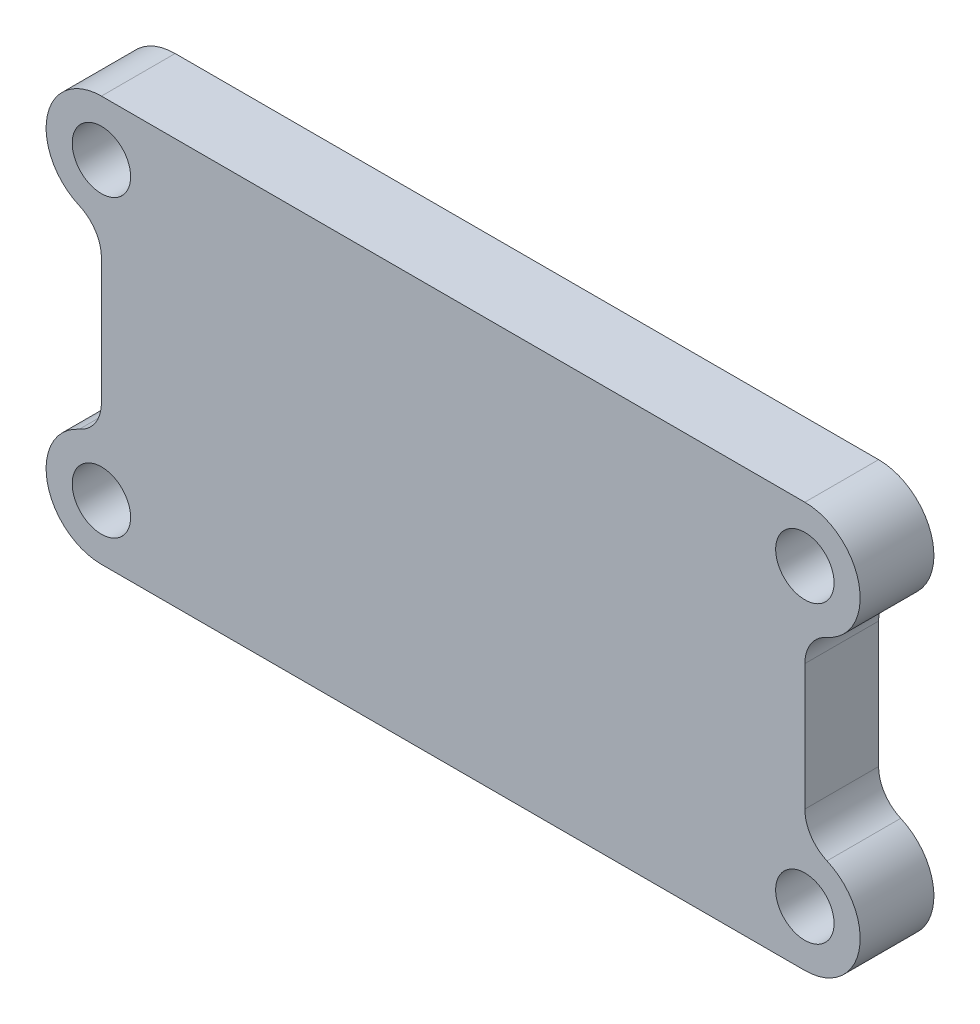
ISO-10303-21;
HEADER;
FILE_DESCRIPTION(('STEP AP214'),'2;1');
FILE_NAME('part.step','',(''),(''),'','','');
FILE_SCHEMA(('AUTOMOTIVE_DESIGN { 1 0 10303 214 1 1 1 1 }'));
ENDSEC;
DATA;
#1=APPLICATION_CONTEXT('core data for automotive mechanical design processes');
#2=APPLICATION_PROTOCOL_DEFINITION('international standard','automotive_design',2000,#1);
#3=PRODUCT_CONTEXT('',#1,'mechanical');
#4=PRODUCT('Part','Part','',(#3));
#5=PRODUCT_RELATED_PRODUCT_CATEGORY('part','',(#4));
#6=PRODUCT_DEFINITION_FORMATION('','',#4);
#7=PRODUCT_DEFINITION_CONTEXT('part definition',#1,'design');
#8=PRODUCT_DEFINITION('design','',#6,#7);
#9=PRODUCT_DEFINITION_SHAPE('','',#8);
#10=(LENGTH_UNIT() NAMED_UNIT(*) SI_UNIT(.MILLI.,.METRE.));
#11=(NAMED_UNIT(*) PLANE_ANGLE_UNIT() SI_UNIT($,.RADIAN.));
#12=(NAMED_UNIT(*) SI_UNIT($,.STERADIAN.) SOLID_ANGLE_UNIT());
#13=UNCERTAINTY_MEASURE_WITH_UNIT(LENGTH_MEASURE(1.E-05),#10,'distance_accuracy_value','');
#14=(GEOMETRIC_REPRESENTATION_CONTEXT(3) GLOBAL_UNCERTAINTY_ASSIGNED_CONTEXT((#13)) GLOBAL_UNIT_ASSIGNED_CONTEXT((#10,
#11,#12)) REPRESENTATION_CONTEXT('',''));
#15=CARTESIAN_POINT('',(0.,0.,0.));
#16=DIRECTION('',(0.,0.,1.));
#17=DIRECTION('',(1.,0.,0.));
#18=AXIS2_PLACEMENT_3D('',#15,#16,#17);
#19=CARTESIAN_POINT('',(58.8645,30.8251610842576,6.35));
#20=DIRECTION('',(0.,0.,1.));
#21=DIRECTION('',(1.,0.,0.));
#22=AXIS2_PLACEMENT_3D('',#19,#20,#21);
#23=PLANE('',#22);
#24=CARTESIAN_POINT('',(-4.8895,12.7,6.35));
#25=DIRECTION('',(0.,0.,1.));
#26=DIRECTION('',(1.,0.,0.));
#27=AXIS2_PLACEMENT_3D('',#24,#25,#26);
#28=CIRCLE('',#27,2.5146);
#29=CARTESIAN_POINT('',(-2.3749,12.7,6.35));
#30=VERTEX_POINT('',#29);
#31=EDGE_CURVE('E295',#30,#30,#28,.T.);
#32=ORIENTED_EDGE('',*,*,#31,.F.);
#33=EDGE_LOOP('',(#32));
#34=FACE_BOUND('',#33,.T.);
#35=CARTESIAN_POINT('',(55.6895,38.1,6.35));
#36=DIRECTION('',(0.,0.,1.));
#37=DIRECTION('',(1.,0.,0.));
#38=AXIS2_PLACEMENT_3D('',#35,#36,#37);
#39=CIRCLE('',#38,2.5146);
#40=CARTESIAN_POINT('',(58.2041,38.1,6.35));
#41=VERTEX_POINT('',#40);
#42=EDGE_CURVE('E162',#41,#41,#39,.T.);
#43=ORIENTED_EDGE('',*,*,#42,.F.);
#44=EDGE_LOOP('',(#43));
#45=FACE_BOUND('',#44,.T.);
#46=CARTESIAN_POINT('',(58.8645,30.8251610842576,6.35));
#47=DIRECTION('',(0.,0.,-1.));
#48=DIRECTION('',(1.,0.,0.));
#49=AXIS2_PLACEMENT_3D('',#46,#47,#48);
#50=CIRCLE('',#49,3.17499999999999);
#51=CARTESIAN_POINT('',(55.6895,30.8251610842576,6.35));
#52=VERTEX_POINT('',#51);
#53=CARTESIAN_POINT('',(57.5945,33.7350966505546,6.35));
#54=VERTEX_POINT('',#53);
#55=EDGE_CURVE('E181',#52,#54,#50,.T.);
#56=ORIENTED_EDGE('',*,*,#55,.T.);
#57=CARTESIAN_POINT('',(55.6895,38.1,6.35));
#58=DIRECTION('',(0.,0.,1.));
#59=DIRECTION('',(1.,0.,0.));
#60=AXIS2_PLACEMENT_3D('',#57,#58,#59);
#61=CIRCLE('',#60,4.76250000000001);
#62=CARTESIAN_POINT('',(55.6895,42.8625,6.35));
#63=VERTEX_POINT('',#62);
#64=EDGE_CURVE('E109',#54,#63,#61,.T.);
#65=ORIENTED_EDGE('',*,*,#64,.T.);
#66=DIRECTION('',(-1.,0.,0.));
#67=VECTOR('',#66,1.);
#68=CARTESIAN_POINT('',(-4.8895,42.8625,6.35));
#69=LINE('',#68,#67);
#70=CARTESIAN_POINT('',(-4.8895,42.8625,6.35));
#71=VERTEX_POINT('',#70);
#72=EDGE_CURVE('E208',#63,#71,#69,.T.);
#73=ORIENTED_EDGE('',*,*,#72,.T.);
#74=CARTESIAN_POINT('',(-4.8895,38.1,6.35));
#75=DIRECTION('',(0.,0.,1.));
#76=DIRECTION('',(1.,0.,0.));
#77=AXIS2_PLACEMENT_3D('',#74,#75,#76);
#78=CIRCLE('',#77,4.7625);
#79=CARTESIAN_POINT('',(-6.7945,33.7350966505546,6.35));
#80=VERTEX_POINT('',#79);
#81=EDGE_CURVE('E227',#71,#80,#78,.T.);
#82=ORIENTED_EDGE('',*,*,#81,.T.);
#83=CARTESIAN_POINT('',(-8.0645,30.8251610842576,6.35));
#84=DIRECTION('',(0.,0.,-1.));
#85=DIRECTION('',(1.,0.,0.));
#86=AXIS2_PLACEMENT_3D('',#83,#84,#85);
#87=CIRCLE('',#86,3.175);
#88=CARTESIAN_POINT('',(-4.8895,30.8251610842576,6.35));
#89=VERTEX_POINT('',#88);
#90=EDGE_CURVE('E224',#80,#89,#87,.T.);
#91=ORIENTED_EDGE('',*,*,#90,.T.);
#92=DIRECTION('',(0.,-1.,0.));
#93=VECTOR('',#92,1.);
#94=CARTESIAN_POINT('',(-4.8895,30.8251610842576,6.35));
#95=LINE('',#94,#93);
#96=CARTESIAN_POINT('',(-4.8895,19.9748389157424,6.35));
#97=VERTEX_POINT('',#96);
#98=EDGE_CURVE('E226',#89,#97,#95,.T.);
#99=ORIENTED_EDGE('',*,*,#98,.T.);
#100=CARTESIAN_POINT('',(-8.0645,19.9748389157424,6.35));
#101=DIRECTION('',(0.,0.,-1.));
#102=DIRECTION('',(1.,0.,0.));
#103=AXIS2_PLACEMENT_3D('',#100,#101,#102);
#104=CIRCLE('',#103,3.175);
#105=CARTESIAN_POINT('',(-6.7945,17.0649033494454,6.35));
#106=VERTEX_POINT('',#105);
#107=EDGE_CURVE('E229',#97,#106,#104,.T.);
#108=ORIENTED_EDGE('',*,*,#107,.T.);
#109=CARTESIAN_POINT('',(-4.8895,12.7,6.35));
#110=DIRECTION('',(0.,0.,1.));
#111=DIRECTION('',(1.,0.,0.));
#112=AXIS2_PLACEMENT_3D('',#109,#110,#111);
#113=CIRCLE('',#112,4.7625);
#114=CARTESIAN_POINT('',(-4.8895,7.9375,6.35));
#115=VERTEX_POINT('',#114);
#116=EDGE_CURVE('E235',#106,#115,#113,.T.);
#117=ORIENTED_EDGE('',*,*,#116,.T.);
#118=DIRECTION('',(1.,0.,0.));
#119=VECTOR('',#118,1.);
#120=CARTESIAN_POINT('',(-4.88949999999999,7.9375,6.35));
#121=LINE('',#120,#119);
#122=CARTESIAN_POINT('',(55.6895,7.9375,6.35));
#123=VERTEX_POINT('',#122);
#124=EDGE_CURVE('E140',#115,#123,#121,.T.);
#125=ORIENTED_EDGE('',*,*,#124,.T.);
#126=CARTESIAN_POINT('',(55.6895,12.7,6.35));
#127=DIRECTION('',(0.,0.,1.));
#128=DIRECTION('',(1.,0.,0.));
#129=AXIS2_PLACEMENT_3D('',#126,#127,#128);
#130=CIRCLE('',#129,4.7625);
#131=CARTESIAN_POINT('',(57.5945,17.0649033494454,6.35));
#132=VERTEX_POINT('',#131);
#133=EDGE_CURVE('E134',#123,#132,#130,.T.);
#134=ORIENTED_EDGE('',*,*,#133,.T.);
#135=CARTESIAN_POINT('',(58.8645,19.9748389157424,6.35));
#136=DIRECTION('',(0.,0.,-1.));
#137=DIRECTION('',(1.,0.,0.));
#138=AXIS2_PLACEMENT_3D('',#135,#136,#137);
#139=CIRCLE('',#138,3.175);
#140=CARTESIAN_POINT('',(55.6895,19.9748389157424,6.35));
#141=VERTEX_POINT('',#140);
#142=EDGE_CURVE('E138',#132,#141,#139,.T.);
#143=ORIENTED_EDGE('',*,*,#142,.T.);
#144=DIRECTION('',(0.,1.,0.));
#145=VECTOR('',#144,1.);
#146=CARTESIAN_POINT('',(55.6895,30.8251610842576,6.35));
#147=LINE('',#146,#145);
#148=EDGE_CURVE('E54',#141,#52,#147,.T.);
#149=ORIENTED_EDGE('',*,*,#148,.T.);
#150=EDGE_LOOP('',(#56,#65,#73,#82,#91,#99,#108,#117,#125,#134,#143,#149));
#151=FACE_BOUND('',#150,.T.);
#152=CARTESIAN_POINT('',(55.6895,12.7,6.35));
#153=DIRECTION('',(0.,0.,1.));
#154=DIRECTION('',(1.,0.,0.));
#155=AXIS2_PLACEMENT_3D('',#152,#153,#154);
#156=CIRCLE('',#155,2.5146);
#157=CARTESIAN_POINT('',(58.2041,12.7,6.35));
#158=VERTEX_POINT('',#157);
#159=EDGE_CURVE('E301',#158,#158,#156,.T.);
#160=ORIENTED_EDGE('',*,*,#159,.F.);
#161=EDGE_LOOP('',(#160));
#162=FACE_BOUND('',#161,.T.);
#163=CARTESIAN_POINT('',(-4.8895,38.1,6.35));
#164=DIRECTION('',(0.,0.,1.));
#165=DIRECTION('',(1.,0.,0.));
#166=AXIS2_PLACEMENT_3D('',#163,#164,#165);
#167=CIRCLE('',#166,2.5146);
#168=CARTESIAN_POINT('',(-2.3749,38.1,6.35));
#169=VERTEX_POINT('',#168);
#170=EDGE_CURVE('E286',#169,#169,#167,.T.);
#171=ORIENTED_EDGE('',*,*,#170,.F.);
#172=EDGE_LOOP('',(#171));
#173=FACE_BOUND('',#172,.T.);
#174=ADVANCED_FACE('F37',(#34,#45,#151,#162,#173),#23,.T.);
#175=CARTESIAN_POINT('',(58.8645,30.8251610842576,0.));
#176=DIRECTION('',(0.,0.,1.));
#177=DIRECTION('',(1.,0.,0.));
#178=AXIS2_PLACEMENT_3D('',#175,#176,#177);
#179=PLANE('',#178);
#180=CARTESIAN_POINT('',(58.8645,30.8251610842576,0.));
#181=DIRECTION('',(0.,0.,-1.));
#182=DIRECTION('',(1.,0.,0.));
#183=AXIS2_PLACEMENT_3D('',#180,#181,#182);
#184=CIRCLE('',#183,3.17499999999999);
#185=CARTESIAN_POINT('',(55.6895,30.8251610842576,0.));
#186=VERTEX_POINT('',#185);
#187=CARTESIAN_POINT('',(57.5945,33.7350966505546,0.));
#188=VERTEX_POINT('',#187);
#189=EDGE_CURVE('E158',#186,#188,#184,.T.);
#190=ORIENTED_EDGE('',*,*,#189,.F.);
#191=DIRECTION('',(0.,1.,0.));
#192=VECTOR('',#191,1.);
#193=CARTESIAN_POINT('',(55.6895,30.8251610842576,0.));
#194=LINE('',#193,#192);
#195=CARTESIAN_POINT('',(55.6895,19.9748389157424,0.));
#196=VERTEX_POINT('',#195);
#197=EDGE_CURVE('E101',#196,#186,#194,.T.);
#198=ORIENTED_EDGE('',*,*,#197,.F.);
#199=CARTESIAN_POINT('',(58.8645,19.9748389157424,0.));
#200=DIRECTION('',(0.,0.,-1.));
#201=DIRECTION('',(1.,0.,0.));
#202=AXIS2_PLACEMENT_3D('',#199,#200,#201);
#203=CIRCLE('',#202,3.175);
#204=CARTESIAN_POINT('',(57.5945,17.0649033494454,0.));
#205=VERTEX_POINT('',#204);
#206=EDGE_CURVE('E95',#205,#196,#203,.T.);
#207=ORIENTED_EDGE('',*,*,#206,.F.);
#208=CARTESIAN_POINT('',(55.6895,12.7,0.));
#209=DIRECTION('',(0.,0.,1.));
#210=DIRECTION('',(1.,0.,0.));
#211=AXIS2_PLACEMENT_3D('',#208,#209,#210);
#212=CIRCLE('',#211,4.7625);
#213=CARTESIAN_POINT('',(55.6895,7.9375,0.));
#214=VERTEX_POINT('',#213);
#215=EDGE_CURVE('E148',#214,#205,#212,.T.);
#216=ORIENTED_EDGE('',*,*,#215,.F.);
#217=DIRECTION('',(1.,0.,0.));
#218=VECTOR('',#217,1.);
#219=CARTESIAN_POINT('',(-4.88949999999999,7.9375,0.));
#220=LINE('',#219,#218);
#221=CARTESIAN_POINT('',(-4.8895,7.9375,0.));
#222=VERTEX_POINT('',#221);
#223=EDGE_CURVE('E176',#222,#214,#220,.T.);
#224=ORIENTED_EDGE('',*,*,#223,.F.);
#225=CARTESIAN_POINT('',(-4.8895,12.7,0.));
#226=DIRECTION('',(0.,0.,1.));
#227=DIRECTION('',(1.,0.,0.));
#228=AXIS2_PLACEMENT_3D('',#225,#226,#227);
#229=CIRCLE('',#228,4.7625);
#230=CARTESIAN_POINT('',(-6.7945,17.0649033494454,0.));
#231=VERTEX_POINT('',#230);
#232=EDGE_CURVE('E174',#231,#222,#229,.T.);
#233=ORIENTED_EDGE('',*,*,#232,.F.);
#234=CARTESIAN_POINT('',(-8.0645,19.9748389157424,0.));
#235=DIRECTION('',(0.,0.,-1.));
#236=DIRECTION('',(1.,0.,0.));
#237=AXIS2_PLACEMENT_3D('',#234,#235,#236);
#238=CIRCLE('',#237,3.175);
#239=CARTESIAN_POINT('',(-4.8895,19.9748389157424,0.));
#240=VERTEX_POINT('',#239);
#241=EDGE_CURVE('E172',#240,#231,#238,.T.);
#242=ORIENTED_EDGE('',*,*,#241,.F.);
#243=DIRECTION('',(0.,-1.,0.));
#244=VECTOR('',#243,1.);
#245=CARTESIAN_POINT('',(-4.8895,30.8251610842576,0.));
#246=LINE('',#245,#244);
#247=CARTESIAN_POINT('',(-4.8895,30.8251610842576,0.));
#248=VERTEX_POINT('',#247);
#249=EDGE_CURVE('E170',#248,#240,#246,.T.);
#250=ORIENTED_EDGE('',*,*,#249,.F.);
#251=CARTESIAN_POINT('',(-8.0645,30.8251610842576,0.));
#252=DIRECTION('',(0.,0.,-1.));
#253=DIRECTION('',(1.,0.,0.));
#254=AXIS2_PLACEMENT_3D('',#251,#252,#253);
#255=CIRCLE('',#254,3.175);
#256=CARTESIAN_POINT('',(-6.7945,33.7350966505546,0.));
#257=VERTEX_POINT('',#256);
#258=EDGE_CURVE('E168',#257,#248,#255,.T.);
#259=ORIENTED_EDGE('',*,*,#258,.F.);
#260=CARTESIAN_POINT('',(-4.8895,38.1,0.));
#261=DIRECTION('',(0.,0.,1.));
#262=DIRECTION('',(1.,0.,0.));
#263=AXIS2_PLACEMENT_3D('',#260,#261,#262);
#264=CIRCLE('',#263,4.7625);
#265=CARTESIAN_POINT('',(-4.8895,42.8625,0.));
#266=VERTEX_POINT('',#265);
#267=EDGE_CURVE('E166',#266,#257,#264,.T.);
#268=ORIENTED_EDGE('',*,*,#267,.F.);
#269=DIRECTION('',(-1.,0.,0.));
#270=VECTOR('',#269,1.);
#271=CARTESIAN_POINT('',(-4.8895,42.8625,0.));
#272=LINE('',#271,#270);
#273=CARTESIAN_POINT('',(55.6895,42.8625,0.));
#274=VERTEX_POINT('',#273);
#275=EDGE_CURVE('E164',#274,#266,#272,.T.);
#276=ORIENTED_EDGE('',*,*,#275,.F.);
#277=CARTESIAN_POINT('',(55.6895,38.1,0.));
#278=DIRECTION('',(0.,0.,1.));
#279=DIRECTION('',(1.,0.,0.));
#280=AXIS2_PLACEMENT_3D('',#277,#278,#279);
#281=CIRCLE('',#280,4.76250000000001);
#282=EDGE_CURVE('E161',#188,#274,#281,.T.);
#283=ORIENTED_EDGE('',*,*,#282,.F.);
#284=EDGE_LOOP('',(#190,#198,#207,#216,#224,#233,#242,#250,#259,#268,#276,#283));
#285=FACE_BOUND('',#284,.T.);
#286=CARTESIAN_POINT('',(55.6895,38.1,0.));
#287=DIRECTION('',(0.,0.,1.));
#288=DIRECTION('',(1.,0.,0.));
#289=AXIS2_PLACEMENT_3D('',#286,#287,#288);
#290=CIRCLE('',#289,2.5146);
#291=CARTESIAN_POINT('',(58.2041,38.1,0.));
#292=VERTEX_POINT('',#291);
#293=EDGE_CURVE('E304',#292,#292,#290,.T.);
#294=ORIENTED_EDGE('',*,*,#293,.T.);
#295=EDGE_LOOP('',(#294));
#296=FACE_BOUND('',#295,.T.);
#297=CARTESIAN_POINT('',(55.6895,12.7,0.));
#298=DIRECTION('',(0.,0.,1.));
#299=DIRECTION('',(1.,0.,0.));
#300=AXIS2_PLACEMENT_3D('',#297,#298,#299);
#301=CIRCLE('',#300,2.5146);
#302=CARTESIAN_POINT('',(58.2041,12.7,0.));
#303=VERTEX_POINT('',#302);
#304=EDGE_CURVE('E298',#303,#303,#301,.T.);
#305=ORIENTED_EDGE('',*,*,#304,.T.);
#306=EDGE_LOOP('',(#305));
#307=FACE_BOUND('',#306,.T.);
#308=CARTESIAN_POINT('',(-4.8895,12.7,0.));
#309=DIRECTION('',(0.,0.,1.));
#310=DIRECTION('',(1.,0.,0.));
#311=AXIS2_PLACEMENT_3D('',#308,#309,#310);
#312=CIRCLE('',#311,2.5146);
#313=CARTESIAN_POINT('',(-2.3749,12.7,0.));
#314=VERTEX_POINT('',#313);
#315=EDGE_CURVE('E292',#314,#314,#312,.T.);
#316=ORIENTED_EDGE('',*,*,#315,.T.);
#317=EDGE_LOOP('',(#316));
#318=FACE_BOUND('',#317,.T.);
#319=CARTESIAN_POINT('',(-4.8895,38.1,0.));
#320=DIRECTION('',(0.,0.,1.));
#321=DIRECTION('',(1.,0.,0.));
#322=AXIS2_PLACEMENT_3D('',#319,#320,#321);
#323=CIRCLE('',#322,2.5146);
#324=CARTESIAN_POINT('',(-2.3749,38.1,0.));
#325=VERTEX_POINT('',#324);
#326=EDGE_CURVE('E289',#325,#325,#323,.T.);
#327=ORIENTED_EDGE('',*,*,#326,.T.);
#328=EDGE_LOOP('',(#327));
#329=FACE_BOUND('',#328,.T.);
#330=ADVANCED_FACE('F212',(#285,#296,#307,#318,#329),#179,.F.);
#331=CARTESIAN_POINT('',(58.8645,30.8251610842576,6.35));
#332=DIRECTION('',(0.,0.,-1.));
#333=DIRECTION('',(-1.,0.,0.));
#334=AXIS2_PLACEMENT_3D('',#331,#332,#333);
#335=CYLINDRICAL_SURFACE('',#334,3.17499999999999);
#336=ORIENTED_EDGE('',*,*,#189,.T.);
#337=DIRECTION('',(0.,0.,-1.));
#338=VECTOR('',#337,1.);
#339=CARTESIAN_POINT('',(57.5945,33.7350966505546,6.35));
#340=LINE('',#339,#338);
#341=EDGE_CURVE('E11',#54,#188,#340,.T.);
#342=ORIENTED_EDGE('',*,*,#341,.F.);
#343=ORIENTED_EDGE('',*,*,#55,.F.);
#344=DIRECTION('',(0.,0.,-1.));
#345=VECTOR('',#344,1.);
#346=CARTESIAN_POINT('',(55.6895,30.8251610842576,6.35));
#347=LINE('',#346,#345);
#348=EDGE_CURVE('E154',#52,#186,#347,.T.);
#349=ORIENTED_EDGE('',*,*,#348,.T.);
#350=EDGE_LOOP('',(#336,#342,#343,#349));
#351=FACE_BOUND('',#350,.T.);
#352=ADVANCED_FACE('F39',(#351),#335,.F.);
#353=CARTESIAN_POINT('',(55.6895,38.1,6.35));
#354=DIRECTION('',(0.,0.,-1.));
#355=DIRECTION('',(-1.,0.,0.));
#356=AXIS2_PLACEMENT_3D('',#353,#354,#355);
#357=CYLINDRICAL_SURFACE('',#356,4.76250000000001);
#358=ORIENTED_EDGE('',*,*,#282,.T.);
#359=DIRECTION('',(0.,0.,-1.));
#360=VECTOR('',#359,1.);
#361=CARTESIAN_POINT('',(55.6895,42.8625,6.35));
#362=LINE('',#361,#360);
#363=EDGE_CURVE('E46',#63,#274,#362,.T.);
#364=ORIENTED_EDGE('',*,*,#363,.F.);
#365=ORIENTED_EDGE('',*,*,#64,.F.);
#366=ORIENTED_EDGE('',*,*,#341,.T.);
#367=EDGE_LOOP('',(#358,#364,#365,#366));
#368=FACE_BOUND('',#367,.T.);
#369=ADVANCED_FACE('F424',(#368),#357,.T.);
#370=CARTESIAN_POINT('',(-4.8895,42.8625,6.35));
#371=DIRECTION('',(0.,-1.,0.));
#372=DIRECTION('',(0.,0.,-1.));
#373=AXIS2_PLACEMENT_3D('',#370,#371,#372);
#374=PLANE('',#373);
#375=ORIENTED_EDGE('',*,*,#275,.T.);
#376=DIRECTION('',(0.,0.,-1.));
#377=VECTOR('',#376,1.);
#378=CARTESIAN_POINT('',(-4.8895,42.8625,6.35));
#379=LINE('',#378,#377);
#380=EDGE_CURVE('E200',#71,#266,#379,.T.);
#381=ORIENTED_EDGE('',*,*,#380,.F.);
#382=ORIENTED_EDGE('',*,*,#72,.F.);
#383=ORIENTED_EDGE('',*,*,#363,.T.);
#384=EDGE_LOOP('',(#375,#381,#382,#383));
#385=FACE_BOUND('',#384,.T.);
#386=ADVANCED_FACE('F206',(#385),#374,.F.);
#387=CARTESIAN_POINT('',(-4.8895,38.1,6.35));
#388=DIRECTION('',(0.,0.,-1.));
#389=DIRECTION('',(-1.,0.,0.));
#390=AXIS2_PLACEMENT_3D('',#387,#388,#389);
#391=CYLINDRICAL_SURFACE('',#390,4.7625);
#392=ORIENTED_EDGE('',*,*,#267,.T.);
#393=DIRECTION('',(0.,0.,-1.));
#394=VECTOR('',#393,1.);
#395=CARTESIAN_POINT('',(-6.7945,33.7350966505546,6.35));
#396=LINE('',#395,#394);
#397=EDGE_CURVE('E197',#80,#257,#396,.T.);
#398=ORIENTED_EDGE('',*,*,#397,.F.);
#399=ORIENTED_EDGE('',*,*,#81,.F.);
#400=ORIENTED_EDGE('',*,*,#380,.T.);
#401=EDGE_LOOP('',(#392,#398,#399,#400));
#402=FACE_BOUND('',#401,.T.);
#403=ADVANCED_FACE('F218',(#402),#391,.T.);
#404=CARTESIAN_POINT('',(-8.0645,30.8251610842576,6.35));
#405=DIRECTION('',(0.,0.,-1.));
#406=DIRECTION('',(-1.,0.,0.));
#407=AXIS2_PLACEMENT_3D('',#404,#405,#406);
#408=CYLINDRICAL_SURFACE('',#407,3.175);
#409=ORIENTED_EDGE('',*,*,#258,.T.);
#410=DIRECTION('',(0.,0.,-1.));
#411=VECTOR('',#410,1.);
#412=CARTESIAN_POINT('',(-4.8895,30.8251610842576,6.35));
#413=LINE('',#412,#411);
#414=EDGE_CURVE('E194',#89,#248,#413,.T.);
#415=ORIENTED_EDGE('',*,*,#414,.F.);
#416=ORIENTED_EDGE('',*,*,#90,.F.);
#417=ORIENTED_EDGE('',*,*,#397,.T.);
#418=EDGE_LOOP('',(#409,#415,#416,#417));
#419=FACE_BOUND('',#418,.T.);
#420=ADVANCED_FACE('F222',(#419),#408,.F.);
#421=CARTESIAN_POINT('',(-4.8895,30.8251610842576,6.35));
#422=DIRECTION('',(1.,0.,0.));
#423=DIRECTION('',(0.,1.,0.));
#424=AXIS2_PLACEMENT_3D('',#421,#422,#423);
#425=PLANE('',#424);
#426=ORIENTED_EDGE('',*,*,#249,.T.);
#427=DIRECTION('',(0.,0.,-1.));
#428=VECTOR('',#427,1.);
#429=CARTESIAN_POINT('',(-4.8895,19.9748389157424,6.35));
#430=LINE('',#429,#428);
#431=EDGE_CURVE('E191',#97,#240,#430,.T.);
#432=ORIENTED_EDGE('',*,*,#431,.F.);
#433=ORIENTED_EDGE('',*,*,#98,.F.);
#434=ORIENTED_EDGE('',*,*,#414,.T.);
#435=EDGE_LOOP('',(#426,#432,#433,#434));
#436=FACE_BOUND('',#435,.T.);
#437=ADVANCED_FACE('F385',(#436),#425,.F.);
#438=CARTESIAN_POINT('',(-8.0645,19.9748389157424,6.35));
#439=DIRECTION('',(0.,0.,-1.));
#440=DIRECTION('',(-1.,0.,0.));
#441=AXIS2_PLACEMENT_3D('',#438,#439,#440);
#442=CYLINDRICAL_SURFACE('',#441,3.175);
#443=ORIENTED_EDGE('',*,*,#241,.T.);
#444=DIRECTION('',(0.,0.,-1.));
#445=VECTOR('',#444,1.);
#446=CARTESIAN_POINT('',(-6.7945,17.0649033494454,6.35));
#447=LINE('',#446,#445);
#448=EDGE_CURVE('E188',#106,#231,#447,.T.);
#449=ORIENTED_EDGE('',*,*,#448,.F.);
#450=ORIENTED_EDGE('',*,*,#107,.F.);
#451=ORIENTED_EDGE('',*,*,#431,.T.);
#452=EDGE_LOOP('',(#443,#449,#450,#451));
#453=FACE_BOUND('',#452,.T.);
#454=ADVANCED_FACE('F375',(#453),#442,.F.);
#455=CARTESIAN_POINT('',(-4.8895,12.7,6.35));
#456=DIRECTION('',(0.,0.,-1.));
#457=DIRECTION('',(-1.,0.,0.));
#458=AXIS2_PLACEMENT_3D('',#455,#456,#457);
#459=CYLINDRICAL_SURFACE('',#458,4.7625);
#460=ORIENTED_EDGE('',*,*,#232,.T.);
#461=DIRECTION('',(0.,0.,-1.));
#462=VECTOR('',#461,1.);
#463=CARTESIAN_POINT('',(-4.8895,7.9375,6.35));
#464=LINE('',#463,#462);
#465=EDGE_CURVE('E185',#115,#222,#464,.T.);
#466=ORIENTED_EDGE('',*,*,#465,.F.);
#467=ORIENTED_EDGE('',*,*,#116,.F.);
#468=ORIENTED_EDGE('',*,*,#448,.T.);
#469=EDGE_LOOP('',(#460,#466,#467,#468));
#470=FACE_BOUND('',#469,.T.);
#471=ADVANCED_FACE('F241',(#470),#459,.T.);
#472=CARTESIAN_POINT('',(-4.88949999999999,7.9375,6.35));
#473=DIRECTION('',(0.,1.,0.));
#474=DIRECTION('',(0.,0.,1.));
#475=AXIS2_PLACEMENT_3D('',#472,#473,#474);
#476=PLANE('',#475);
#477=ORIENTED_EDGE('',*,*,#223,.T.);
#478=DIRECTION('',(0.,0.,-1.));
#479=VECTOR('',#478,1.);
#480=CARTESIAN_POINT('',(55.6895,7.9375,6.35));
#481=LINE('',#480,#479);
#482=EDGE_CURVE('E149',#123,#214,#481,.T.);
#483=ORIENTED_EDGE('',*,*,#482,.F.);
#484=ORIENTED_EDGE('',*,*,#124,.F.);
#485=ORIENTED_EDGE('',*,*,#465,.T.);
#486=EDGE_LOOP('',(#477,#483,#484,#485));
#487=FACE_BOUND('',#486,.T.);
#488=ADVANCED_FACE('F245',(#487),#476,.F.);
#489=CARTESIAN_POINT('',(55.6895,12.7,6.35));
#490=DIRECTION('',(0.,0.,-1.));
#491=DIRECTION('',(-1.,0.,0.));
#492=AXIS2_PLACEMENT_3D('',#489,#490,#491);
#493=CYLINDRICAL_SURFACE('',#492,4.7625);
#494=ORIENTED_EDGE('',*,*,#215,.T.);
#495=DIRECTION('',(0.,0.,-1.));
#496=VECTOR('',#495,1.);
#497=CARTESIAN_POINT('',(57.5945,17.0649033494454,6.35));
#498=LINE('',#497,#496);
#499=EDGE_CURVE('E145',#132,#205,#498,.T.);
#500=ORIENTED_EDGE('',*,*,#499,.F.);
#501=ORIENTED_EDGE('',*,*,#133,.F.);
#502=ORIENTED_EDGE('',*,*,#482,.T.);
#503=EDGE_LOOP('',(#494,#500,#501,#502));
#504=FACE_BOUND('',#503,.T.);
#505=ADVANCED_FACE('F146',(#504),#493,.T.);
#506=CARTESIAN_POINT('',(58.8645,19.9748389157424,6.35));
#507=DIRECTION('',(0.,0.,-1.));
#508=DIRECTION('',(-1.,0.,0.));
#509=AXIS2_PLACEMENT_3D('',#506,#507,#508);
#510=CYLINDRICAL_SURFACE('',#509,3.175);
#511=ORIENTED_EDGE('',*,*,#206,.T.);
#512=DIRECTION('',(0.,0.,-1.));
#513=VECTOR('',#512,1.);
#514=CARTESIAN_POINT('',(55.6895,19.9748389157424,6.35));
#515=LINE('',#514,#513);
#516=EDGE_CURVE('E150',#141,#196,#515,.T.);
#517=ORIENTED_EDGE('',*,*,#516,.F.);
#518=ORIENTED_EDGE('',*,*,#142,.F.);
#519=ORIENTED_EDGE('',*,*,#499,.T.);
#520=EDGE_LOOP('',(#511,#517,#518,#519));
#521=FACE_BOUND('',#520,.T.);
#522=ADVANCED_FACE('F152',(#521),#510,.F.);
#523=CARTESIAN_POINT('',(55.6895,30.8251610842576,6.35));
#524=DIRECTION('',(-1.,0.,0.));
#525=DIRECTION('',(0.,-1.,0.));
#526=AXIS2_PLACEMENT_3D('',#523,#524,#525);
#527=PLANE('',#526);
#528=ORIENTED_EDGE('',*,*,#197,.T.);
#529=ORIENTED_EDGE('',*,*,#348,.F.);
#530=ORIENTED_EDGE('',*,*,#148,.F.);
#531=ORIENTED_EDGE('',*,*,#516,.T.);
#532=EDGE_LOOP('',(#528,#529,#530,#531));
#533=FACE_BOUND('',#532,.T.);
#534=ADVANCED_FACE('F249',(#533),#527,.F.);
#535=CARTESIAN_POINT('',(55.6895,38.1,6.35));
#536=DIRECTION('',(0.,0.,-1.));
#537=DIRECTION('',(-1.,0.,0.));
#538=AXIS2_PLACEMENT_3D('',#535,#536,#537);
#539=CYLINDRICAL_SURFACE('',#538,2.5146);
#540=ORIENTED_EDGE('',*,*,#42,.T.);
#541=EDGE_LOOP('',(#540));
#542=FACE_BOUND('',#541,.T.);
#543=ORIENTED_EDGE('',*,*,#293,.F.);
#544=EDGE_LOOP('',(#543));
#545=FACE_BOUND('',#544,.T.);
#546=ADVANCED_FACE('F251',(#542,#545),#539,.F.);
#547=CARTESIAN_POINT('',(55.6895,12.7,6.35));
#548=DIRECTION('',(0.,0.,-1.));
#549=DIRECTION('',(-1.,0.,0.));
#550=AXIS2_PLACEMENT_3D('',#547,#548,#549);
#551=CYLINDRICAL_SURFACE('',#550,2.5146);
#552=ORIENTED_EDGE('',*,*,#159,.T.);
#553=EDGE_LOOP('',(#552));
#554=FACE_BOUND('',#553,.T.);
#555=ORIENTED_EDGE('',*,*,#304,.F.);
#556=EDGE_LOOP('',(#555));
#557=FACE_BOUND('',#556,.T.);
#558=ADVANCED_FACE('F257',(#554,#557),#551,.F.);
#559=CARTESIAN_POINT('',(-4.8895,12.7,6.35));
#560=DIRECTION('',(0.,0.,-1.));
#561=DIRECTION('',(-1.,0.,0.));
#562=AXIS2_PLACEMENT_3D('',#559,#560,#561);
#563=CYLINDRICAL_SURFACE('',#562,2.5146);
#564=ORIENTED_EDGE('',*,*,#31,.T.);
#565=EDGE_LOOP('',(#564));
#566=FACE_BOUND('',#565,.T.);
#567=ORIENTED_EDGE('',*,*,#315,.F.);
#568=EDGE_LOOP('',(#567));
#569=FACE_BOUND('',#568,.T.);
#570=ADVANCED_FACE('F273',(#566,#569),#563,.F.);
#571=CARTESIAN_POINT('',(-4.8895,38.1,6.35));
#572=DIRECTION('',(0.,0.,-1.));
#573=DIRECTION('',(-1.,0.,0.));
#574=AXIS2_PLACEMENT_3D('',#571,#572,#573);
#575=CYLINDRICAL_SURFACE('',#574,2.5146);
#576=ORIENTED_EDGE('',*,*,#170,.T.);
#577=EDGE_LOOP('',(#576));
#578=FACE_BOUND('',#577,.T.);
#579=ORIENTED_EDGE('',*,*,#326,.F.);
#580=EDGE_LOOP('',(#579));
#581=FACE_BOUND('',#580,.T.);
#582=ADVANCED_FACE('F277',(#578,#581),#575,.F.);
#583=CLOSED_SHELL('',(#174,#330,#352,#369,#386,#403,#420,#437,#454,#471,#488,#505,#522,#534,
#546,#558,#570,#582));
#584=MANIFOLD_SOLID_BREP('B2',#583);
#585=ADVANCED_BREP_SHAPE_REPRESENTATION('',(#18,#584),#14);
#586=SHAPE_DEFINITION_REPRESENTATION(#9,#585);
ENDSEC;
END-ISO-10303-21;
